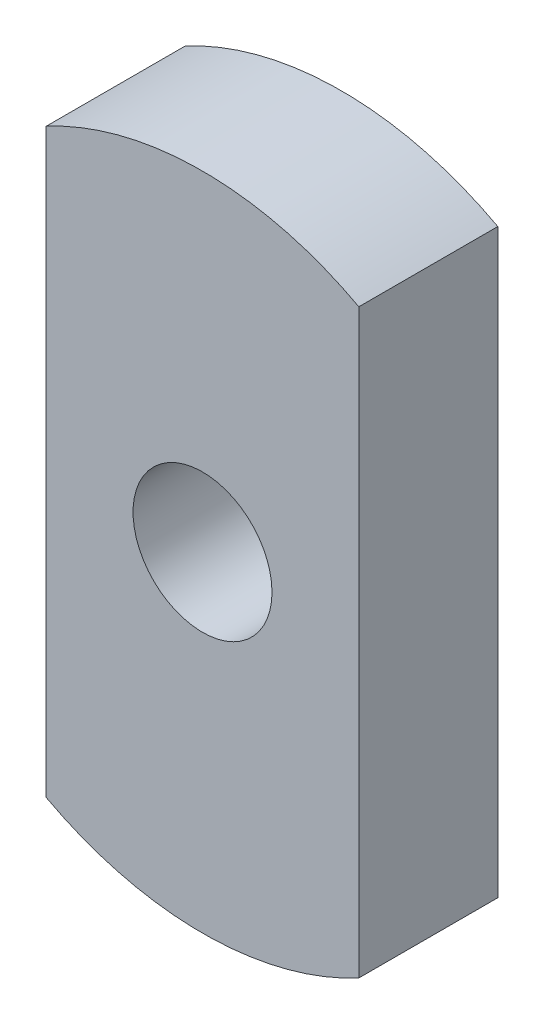
ISO-10303-21;
HEADER;
FILE_DESCRIPTION(('STEP AP214'),'2;1');
FILE_NAME('part.step','',(''),(''),'','','');
FILE_SCHEMA(('AUTOMOTIVE_DESIGN { 1 0 10303 214 1 1 1 1 }'));
ENDSEC;
DATA;
#1=APPLICATION_CONTEXT('core data for automotive mechanical design processes');
#2=APPLICATION_PROTOCOL_DEFINITION('international standard','automotive_design',2000,#1);
#3=PRODUCT_CONTEXT('',#1,'mechanical');
#4=PRODUCT('Part','Part','',(#3));
#5=PRODUCT_RELATED_PRODUCT_CATEGORY('part','',(#4));
#6=PRODUCT_DEFINITION_FORMATION('','',#4);
#7=PRODUCT_DEFINITION_CONTEXT('part definition',#1,'design');
#8=PRODUCT_DEFINITION('design','',#6,#7);
#9=PRODUCT_DEFINITION_SHAPE('','',#8);
#10=(LENGTH_UNIT() NAMED_UNIT(*) SI_UNIT(.MILLI.,.METRE.));
#11=(NAMED_UNIT(*) PLANE_ANGLE_UNIT() SI_UNIT($,.RADIAN.));
#12=(NAMED_UNIT(*) SI_UNIT($,.STERADIAN.) SOLID_ANGLE_UNIT());
#13=UNCERTAINTY_MEASURE_WITH_UNIT(LENGTH_MEASURE(1.E-05),#10,'distance_accuracy_value','');
#14=(GEOMETRIC_REPRESENTATION_CONTEXT(3) GLOBAL_UNCERTAINTY_ASSIGNED_CONTEXT((#13)) GLOBAL_UNIT_ASSIGNED_CONTEXT((#10,
#11,#12)) REPRESENTATION_CONTEXT('',''));
#15=CARTESIAN_POINT('',(0.,0.,0.));
#16=DIRECTION('',(0.,0.,1.));
#17=DIRECTION('',(1.,0.,0.));
#18=AXIS2_PLACEMENT_3D('',#15,#16,#17);
#19=CARTESIAN_POINT('',(0.,0.,4.));
#20=DIRECTION('',(0.,0.,-1.));
#21=DIRECTION('',(-1.,0.,0.));
#22=AXIS2_PLACEMENT_3D('',#19,#20,#21);
#23=PLANE('',#22);
#24=CARTESIAN_POINT('',(0.,0.,4.));
#25=DIRECTION('',(0.,0.,1.));
#26=DIRECTION('',(-1.,0.,0.));
#27=AXIS2_PLACEMENT_3D('',#24,#25,#26);
#28=CIRCLE('',#27,9.5);
#29=CARTESIAN_POINT('',(4.5,8.36660026534075,4.));
#30=VERTEX_POINT('',#29);
#31=CARTESIAN_POINT('',(-4.5,8.36660026534075,4.));
#32=VERTEX_POINT('',#31);
#33=EDGE_CURVE('E85',#30,#32,#28,.T.);
#34=ORIENTED_EDGE('',*,*,#33,.T.);
#35=DIRECTION('',(0.,-1.,0.));
#36=VECTOR('',#35,1.);
#37=CARTESIAN_POINT('',(-4.5,8.36660026534075,4.));
#38=LINE('',#37,#36);
#39=CARTESIAN_POINT('',(-4.5,-8.36660026534075,4.));
#40=VERTEX_POINT('',#39);
#41=EDGE_CURVE('E80',#32,#40,#38,.T.);
#42=ORIENTED_EDGE('',*,*,#41,.T.);
#43=CARTESIAN_POINT('',(0.,0.,4.));
#44=DIRECTION('',(0.,0.,1.));
#45=DIRECTION('',(1.,0.,0.));
#46=AXIS2_PLACEMENT_3D('',#43,#44,#45);
#47=CIRCLE('',#46,9.50000000000001);
#48=CARTESIAN_POINT('',(4.49999999999999,-8.36660026534076,4.));
#49=VERTEX_POINT('',#48);
#50=EDGE_CURVE('E83',#40,#49,#47,.T.);
#51=ORIENTED_EDGE('',*,*,#50,.T.);
#52=DIRECTION('',(0.,1.,0.));
#53=VECTOR('',#52,1.);
#54=CARTESIAN_POINT('',(4.5,8.36660026534075,4.));
#55=LINE('',#54,#53);
#56=EDGE_CURVE('E50',#49,#30,#55,.T.);
#57=ORIENTED_EDGE('',*,*,#56,.T.);
#58=EDGE_LOOP('',(#34,#42,#51,#57));
#59=FACE_BOUND('',#58,.T.);
#60=CARTESIAN_POINT('',(0.,0.,4.));
#61=DIRECTION('',(0.,0.,1.));
#62=DIRECTION('',(1.,0.,0.));
#63=AXIS2_PLACEMENT_3D('',#60,#61,#62);
#64=CIRCLE('',#63,2.);
#65=CARTESIAN_POINT('',(2.,0.,4.));
#66=VERTEX_POINT('',#65);
#67=EDGE_CURVE('E100',#66,#66,#64,.T.);
#68=ORIENTED_EDGE('',*,*,#67,.F.);
#69=EDGE_LOOP('',(#68));
#70=FACE_BOUND('',#69,.T.);
#71=ADVANCED_FACE('F33',(#59,#70),#23,.F.);
#72=CARTESIAN_POINT('',(0.,0.,0.));
#73=DIRECTION('',(0.,0.,-1.));
#74=DIRECTION('',(-1.,0.,0.));
#75=AXIS2_PLACEMENT_3D('',#72,#73,#74);
#76=PLANE('',#75);
#77=CARTESIAN_POINT('',(0.,0.,0.));
#78=DIRECTION('',(0.,0.,1.));
#79=DIRECTION('',(-1.,0.,0.));
#80=AXIS2_PLACEMENT_3D('',#77,#78,#79);
#81=CIRCLE('',#80,9.5);
#82=CARTESIAN_POINT('',(4.5,8.36660026534075,0.));
#83=VERTEX_POINT('',#82);
#84=CARTESIAN_POINT('',(-4.5,8.36660026534075,0.));
#85=VERTEX_POINT('',#84);
#86=EDGE_CURVE('E97',#83,#85,#81,.T.);
#87=ORIENTED_EDGE('',*,*,#86,.F.);
#88=DIRECTION('',(0.,1.,0.));
#89=VECTOR('',#88,1.);
#90=CARTESIAN_POINT('',(4.5,8.36660026534075,0.));
#91=LINE('',#90,#89);
#92=CARTESIAN_POINT('',(4.49999999999999,-8.36660026534076,0.));
#93=VERTEX_POINT('',#92);
#94=EDGE_CURVE('E73',#93,#83,#91,.T.);
#95=ORIENTED_EDGE('',*,*,#94,.F.);
#96=CARTESIAN_POINT('',(0.,0.,0.));
#97=DIRECTION('',(0.,0.,1.));
#98=DIRECTION('',(1.,0.,0.));
#99=AXIS2_PLACEMENT_3D('',#96,#97,#98);
#100=CIRCLE('',#99,9.50000000000001);
#101=CARTESIAN_POINT('',(-4.5,-8.36660026534075,0.));
#102=VERTEX_POINT('',#101);
#103=EDGE_CURVE('E67',#102,#93,#100,.T.);
#104=ORIENTED_EDGE('',*,*,#103,.F.);
#105=DIRECTION('',(0.,-1.,0.));
#106=VECTOR('',#105,1.);
#107=CARTESIAN_POINT('',(-4.5,8.36660026534075,0.));
#108=LINE('',#107,#106);
#109=EDGE_CURVE('E89',#85,#102,#108,.T.);
#110=ORIENTED_EDGE('',*,*,#109,.F.);
#111=EDGE_LOOP('',(#87,#95,#104,#110));
#112=FACE_BOUND('',#111,.T.);
#113=CARTESIAN_POINT('',(0.,0.,0.));
#114=DIRECTION('',(0.,0.,1.));
#115=DIRECTION('',(1.,0.,0.));
#116=AXIS2_PLACEMENT_3D('',#113,#114,#115);
#117=CIRCLE('',#116,2.);
#118=CARTESIAN_POINT('',(2.,0.,0.));
#119=VERTEX_POINT('',#118);
#120=EDGE_CURVE('E112',#119,#119,#117,.T.);
#121=ORIENTED_EDGE('',*,*,#120,.T.);
#122=EDGE_LOOP('',(#121));
#123=FACE_BOUND('',#122,.T.);
#124=ADVANCED_FACE('F108',(#112,#123),#76,.T.);
#125=CARTESIAN_POINT('',(0.,0.,4.));
#126=DIRECTION('',(0.,0.,-1.));
#127=DIRECTION('',(-1.,0.,0.));
#128=AXIS2_PLACEMENT_3D('',#125,#126,#127);
#129=CYLINDRICAL_SURFACE('',#128,9.5);
#130=ORIENTED_EDGE('',*,*,#86,.T.);
#131=DIRECTION('',(0.,0.,-1.));
#132=VECTOR('',#131,1.);
#133=CARTESIAN_POINT('',(-4.5,8.36660026534075,4.));
#134=LINE('',#133,#132);
#135=EDGE_CURVE('E11',#32,#85,#134,.T.);
#136=ORIENTED_EDGE('',*,*,#135,.F.);
#137=ORIENTED_EDGE('',*,*,#33,.F.);
#138=DIRECTION('',(0.,0.,-1.));
#139=VECTOR('',#138,1.);
#140=CARTESIAN_POINT('',(4.5,8.36660026534075,4.));
#141=LINE('',#140,#139);
#142=EDGE_CURVE('E93',#30,#83,#141,.T.);
#143=ORIENTED_EDGE('',*,*,#142,.T.);
#144=EDGE_LOOP('',(#130,#136,#137,#143));
#145=FACE_BOUND('',#144,.T.);
#146=ADVANCED_FACE('F35',(#145),#129,.T.);
#147=CARTESIAN_POINT('',(-4.5,8.36660026534075,4.));
#148=DIRECTION('',(1.,0.,0.));
#149=DIRECTION('',(0.,0.,-1.));
#150=AXIS2_PLACEMENT_3D('',#147,#148,#149);
#151=PLANE('',#150);
#152=ORIENTED_EDGE('',*,*,#109,.T.);
#153=DIRECTION('',(0.,0.,-1.));
#154=VECTOR('',#153,1.);
#155=CARTESIAN_POINT('',(-4.5,-8.36660026534075,4.));
#156=LINE('',#155,#154);
#157=EDGE_CURVE('E42',#40,#102,#156,.T.);
#158=ORIENTED_EDGE('',*,*,#157,.F.);
#159=ORIENTED_EDGE('',*,*,#41,.F.);
#160=ORIENTED_EDGE('',*,*,#135,.T.);
#161=EDGE_LOOP('',(#152,#158,#159,#160));
#162=FACE_BOUND('',#161,.T.);
#163=ADVANCED_FACE('F88',(#162),#151,.F.);
#164=CARTESIAN_POINT('',(0.,0.,4.));
#165=DIRECTION('',(0.,0.,-1.));
#166=DIRECTION('',(-1.,0.,0.));
#167=AXIS2_PLACEMENT_3D('',#164,#165,#166);
#168=CYLINDRICAL_SURFACE('',#167,9.50000000000001);
#169=ORIENTED_EDGE('',*,*,#103,.T.);
#170=DIRECTION('',(0.,0.,-1.));
#171=VECTOR('',#170,1.);
#172=CARTESIAN_POINT('',(4.49999999999999,-8.36660026534076,4.));
#173=LINE('',#172,#171);
#174=EDGE_CURVE('E90',#49,#93,#173,.T.);
#175=ORIENTED_EDGE('',*,*,#174,.F.);
#176=ORIENTED_EDGE('',*,*,#50,.F.);
#177=ORIENTED_EDGE('',*,*,#157,.T.);
#178=EDGE_LOOP('',(#169,#175,#176,#177));
#179=FACE_BOUND('',#178,.T.);
#180=ADVANCED_FACE('F91',(#179),#168,.T.);
#181=CARTESIAN_POINT('',(4.5,8.36660026534075,4.));
#182=DIRECTION('',(-1.,0.,0.));
#183=DIRECTION('',(0.,0.,1.));
#184=AXIS2_PLACEMENT_3D('',#181,#182,#183);
#185=PLANE('',#184);
#186=ORIENTED_EDGE('',*,*,#94,.T.);
#187=ORIENTED_EDGE('',*,*,#142,.F.);
#188=ORIENTED_EDGE('',*,*,#56,.F.);
#189=ORIENTED_EDGE('',*,*,#174,.T.);
#190=EDGE_LOOP('',(#186,#187,#188,#189));
#191=FACE_BOUND('',#190,.T.);
#192=ADVANCED_FACE('F105',(#191),#185,.F.);
#193=CARTESIAN_POINT('',(0.,0.,4.));
#194=DIRECTION('',(0.,0.,-1.));
#195=DIRECTION('',(-1.,0.,0.));
#196=AXIS2_PLACEMENT_3D('',#193,#194,#195);
#197=CYLINDRICAL_SURFACE('',#196,2.);
#198=ORIENTED_EDGE('',*,*,#67,.T.);
#199=EDGE_LOOP('',(#198));
#200=FACE_BOUND('',#199,.T.);
#201=ORIENTED_EDGE('',*,*,#120,.F.);
#202=EDGE_LOOP('',(#201));
#203=FACE_BOUND('',#202,.T.);
#204=ADVANCED_FACE('F118',(#200,#203),#197,.F.);
#205=CLOSED_SHELL('',(#71,#124,#146,#163,#180,#192,#204));
#206=MANIFOLD_SOLID_BREP('B2',#205);
#207=ADVANCED_BREP_SHAPE_REPRESENTATION('',(#18,#206),#14);
#208=SHAPE_DEFINITION_REPRESENTATION(#9,#207);
ENDSEC;
END-ISO-10303-21;
